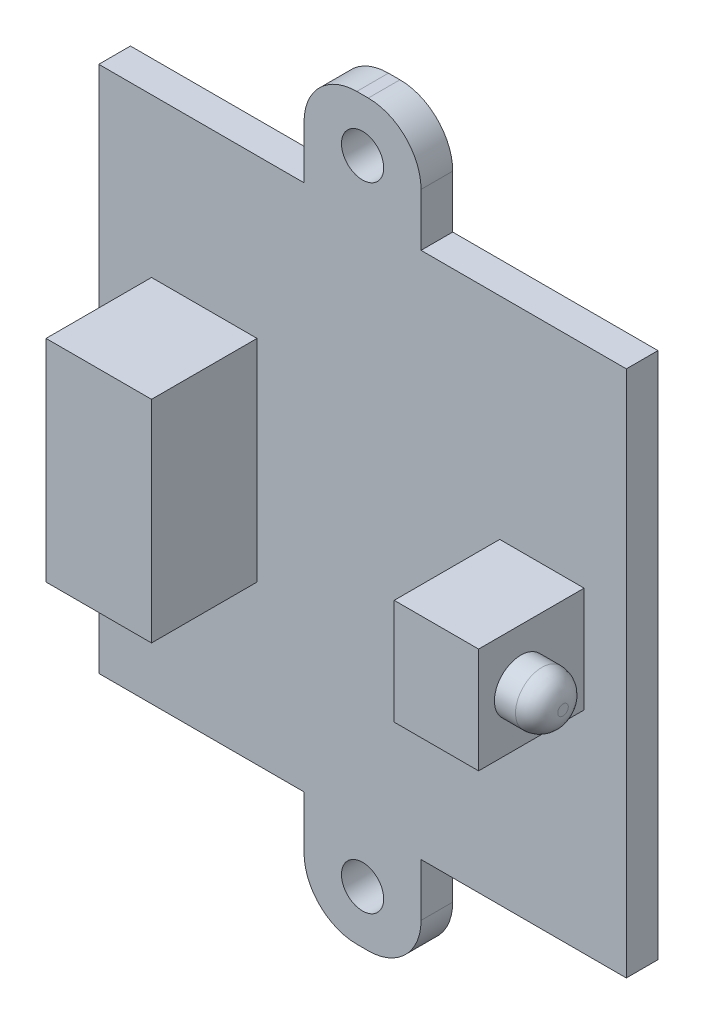
ISO-10303-21;
HEADER;
FILE_DESCRIPTION(('STEP AP214'),'2;1');
FILE_NAME('part.step','',(''),(''),'','','');
FILE_SCHEMA(('AUTOMOTIVE_DESIGN { 1 0 10303 214 1 1 1 1 }'));
ENDSEC;
DATA;
#1=APPLICATION_CONTEXT('core data for automotive mechanical design processes');
#2=APPLICATION_PROTOCOL_DEFINITION('international standard','automotive_design',2000,#1);
#3=PRODUCT_CONTEXT('',#1,'mechanical');
#4=PRODUCT('Part','Part','',(#3));
#5=PRODUCT_RELATED_PRODUCT_CATEGORY('part','',(#4));
#6=PRODUCT_DEFINITION_FORMATION('','',#4);
#7=PRODUCT_DEFINITION_CONTEXT('part definition',#1,'design');
#8=PRODUCT_DEFINITION('design','',#6,#7);
#9=PRODUCT_DEFINITION_SHAPE('','',#8);
#10=(LENGTH_UNIT() NAMED_UNIT(*) SI_UNIT(.MILLI.,.METRE.));
#11=(NAMED_UNIT(*) PLANE_ANGLE_UNIT() SI_UNIT($,.RADIAN.));
#12=(NAMED_UNIT(*) SI_UNIT($,.STERADIAN.) SOLID_ANGLE_UNIT());
#13=UNCERTAINTY_MEASURE_WITH_UNIT(LENGTH_MEASURE(1.E-05),#10,'distance_accuracy_value','');
#14=(GEOMETRIC_REPRESENTATION_CONTEXT(3) GLOBAL_UNCERTAINTY_ASSIGNED_CONTEXT((#13)) GLOBAL_UNIT_ASSIGNED_CONTEXT((#10,
#11,#12)) REPRESENTATION_CONTEXT('',''));
#15=CARTESIAN_POINT('',(0.,0.,0.));
#16=DIRECTION('',(0.,0.,1.));
#17=DIRECTION('',(1.,0.,0.));
#18=AXIS2_PLACEMENT_3D('',#15,#16,#17);
#19=CARTESIAN_POINT('',(25.,12.5,4.5));
#20=DIRECTION('',(1.,0.,0.));
#21=DIRECTION('',(0.,0.,-1.));
#22=AXIS2_PLACEMENT_3D('',#19,#20,#21);
#23=PLANE('',#22);
#24=CARTESIAN_POINT('',(25.,12.5,4.5));
#25=DIRECTION('',(-1.,0.,0.));
#26=DIRECTION('',(0.,0.,1.));
#27=AXIS2_PLACEMENT_3D('',#24,#25,#26);
#28=CIRCLE('',#27,0.249999999999999);
#29=CARTESIAN_POINT('',(25.,12.5,4.75));
#30=VERTEX_POINT('',#29);
#31=CARTESIAN_POINT('',(25.,12.5,4.25));
#32=VERTEX_POINT('',#31);
#33=EDGE_CURVE('E151',#30,#32,#28,.T.);
#34=ORIENTED_EDGE('',*,*,#33,.F.);
#35=CARTESIAN_POINT('',(25.,12.5,4.5));
#36=DIRECTION('',(-1.,0.,0.));
#37=DIRECTION('',(0.,0.,-1.));
#38=AXIS2_PLACEMENT_3D('',#35,#36,#37);
#39=CIRCLE('',#38,0.250000000000001);
#40=EDGE_CURVE('E154',#32,#30,#39,.T.);
#41=ORIENTED_EDGE('',*,*,#40,.F.);
#42=EDGE_LOOP('',(#34,#41));
#43=FACE_BOUND('',#42,.T.);
#44=ADVANCED_FACE('F17',(#43),#23,.T.);
#45=CARTESIAN_POINT('',(24.,12.5,4.25));
#46=DIRECTION('',(0.,1.,0.));
#47=DIRECTION('',(0.,0.,-1.));
#48=AXIS2_PLACEMENT_3D('',#45,#46,#47);
#49=CIRCLE('',#48,1.);
#50=TRIMMED_CURVE('',#49,(PARAMETER_VALUE(-1.82347658193698)),
(PARAMETER_VALUE(1.82347658193698)),.T.,.PARAMETER.);
#51=CARTESIAN_POINT('',(24.,12.5,4.5));
#52=DIRECTION('',(1.,0.,0.));
#53=AXIS1_PLACEMENT('',#51,#52);
#54=SURFACE_OF_REVOLUTION('',#50,#53);
#55=CARTESIAN_POINT('',(24.,12.5,4.5));
#56=DIRECTION('',(-1.,0.,0.));
#57=DIRECTION('',(0.,0.,1.));
#58=AXIS2_PLACEMENT_3D('',#55,#56,#57);
#59=CIRCLE('',#58,1.25);
#60=CARTESIAN_POINT('',(24.,12.5,5.75));
#61=VERTEX_POINT('',#60);
#62=EDGE_CURVE('E161',#61,#61,#59,.T.);
#63=ORIENTED_EDGE('',*,*,#62,.F.);
#64=EDGE_LOOP('',(#63));
#65=FACE_BOUND('',#64,.T.);
#66=ORIENTED_EDGE('',*,*,#40,.T.);
#67=ORIENTED_EDGE('',*,*,#33,.T.);
#68=EDGE_LOOP('',(#66,#67));
#69=FACE_BOUND('',#68,.T.);
#70=ADVANCED_FACE('F160',(#65,#69),#54,.F.);
#71=CARTESIAN_POINT('',(0.,0.,6.5));
#72=DIRECTION('',(0.,0.,-1.));
#73=DIRECTION('',(-1.,0.,0.));
#74=AXIS2_PLACEMENT_3D('',#71,#72,#73);
#75=PLANE('',#74);
#76=DIRECTION('',(1.,0.,0.));
#77=VECTOR('',#76,1.);
#78=CARTESIAN_POINT('',(2.5,17.5,6.5));
#79=LINE('',#78,#77);
#80=CARTESIAN_POINT('',(7.5,17.5,6.5));
#81=VERTEX_POINT('',#80);
#82=CARTESIAN_POINT('',(2.5,17.5,6.5));
#83=VERTEX_POINT('',#82);
#84=EDGE_CURVE('E185',#81,#83,#79,.F.);
#85=ORIENTED_EDGE('',*,*,#84,.T.);
#86=DIRECTION('',(0.,1.,0.));
#87=VECTOR('',#86,1.);
#88=CARTESIAN_POINT('',(2.5,7.5,6.5));
#89=LINE('',#88,#87);
#90=CARTESIAN_POINT('',(2.5,7.5,6.5));
#91=VERTEX_POINT('',#90);
#92=EDGE_CURVE('E202',#83,#91,#89,.F.);
#93=ORIENTED_EDGE('',*,*,#92,.T.);
#94=DIRECTION('',(1.,0.,0.));
#95=VECTOR('',#94,1.);
#96=CARTESIAN_POINT('',(2.5,7.5,6.5));
#97=LINE('',#96,#95);
#98=CARTESIAN_POINT('',(7.5,7.5,6.5));
#99=VERTEX_POINT('',#98);
#100=EDGE_CURVE('E193',#91,#99,#97,.T.);
#101=ORIENTED_EDGE('',*,*,#100,.T.);
#102=DIRECTION('',(0.,1.,0.));
#103=VECTOR('',#102,1.);
#104=CARTESIAN_POINT('',(7.5,7.5,6.5));
#105=LINE('',#104,#103);
#106=EDGE_CURVE('E187',#99,#81,#105,.T.);
#107=ORIENTED_EDGE('',*,*,#106,.T.);
#108=EDGE_LOOP('',(#85,#93,#101,#107));
#109=FACE_BOUND('',#108,.T.);
#110=ADVANCED_FACE('F177',(#109),#75,.F.);
#111=CARTESIAN_POINT('',(25.,12.5,4.5));
#112=DIRECTION('',(-1.,0.,0.));
#113=DIRECTION('',(0.,0.,1.));
#114=AXIS2_PLACEMENT_3D('',#111,#112,#113);
#115=CYLINDRICAL_SURFACE('',#114,1.25);
#116=ORIENTED_EDGE('',*,*,#62,.T.);
#117=EDGE_LOOP('',(#116));
#118=FACE_BOUND('',#117,.T.);
#119=CARTESIAN_POINT('',(23.,12.5,4.5));
#120=DIRECTION('',(-1.,0.,0.));
#121=DIRECTION('',(0.,0.,1.));
#122=AXIS2_PLACEMENT_3D('',#119,#120,#121);
#123=CIRCLE('',#122,1.25);
#124=CARTESIAN_POINT('',(23.,12.5,5.75));
#125=VERTEX_POINT('',#124);
#126=EDGE_CURVE('E222',#125,#125,#123,.F.);
#127=ORIENTED_EDGE('',*,*,#126,.T.);
#128=EDGE_LOOP('',(#127));
#129=FACE_BOUND('',#128,.T.);
#130=ADVANCED_FACE('F449',(#118,#129),#115,.T.);
#131=CARTESIAN_POINT('',(0.,0.,6.5));
#132=DIRECTION('',(0.,0.,1.));
#133=DIRECTION('',(1.,0.,0.));
#134=AXIS2_PLACEMENT_3D('',#131,#132,#133);
#135=PLANE('',#134);
#136=DIRECTION('',(0.,1.,0.));
#137=VECTOR('',#136,1.);
#138=CARTESIAN_POINT('',(19.,15.,6.5));
#139=LINE('',#138,#137);
#140=CARTESIAN_POINT('',(19.,15.,6.5));
#141=VERTEX_POINT('',#140);
#142=CARTESIAN_POINT('',(19.,10.,6.5));
#143=VERTEX_POINT('',#142);
#144=EDGE_CURVE('E208',#141,#143,#139,.F.);
#145=ORIENTED_EDGE('',*,*,#144,.T.);
#146=DIRECTION('',(1.,0.,0.));
#147=VECTOR('',#146,1.);
#148=CARTESIAN_POINT('',(19.,10.,6.5));
#149=LINE('',#148,#147);
#150=CARTESIAN_POINT('',(23.,10.,6.5));
#151=VERTEX_POINT('',#150);
#152=EDGE_CURVE('E226',#143,#151,#149,.T.);
#153=ORIENTED_EDGE('',*,*,#152,.T.);
#154=DIRECTION('',(0.,1.,0.));
#155=VECTOR('',#154,1.);
#156=CARTESIAN_POINT('',(23.,10.,6.5));
#157=LINE('',#156,#155);
#158=CARTESIAN_POINT('',(23.,15.,6.5));
#159=VERTEX_POINT('',#158);
#160=EDGE_CURVE('E216',#151,#159,#157,.T.);
#161=ORIENTED_EDGE('',*,*,#160,.T.);
#162=DIRECTION('',(1.,0.,0.));
#163=VECTOR('',#162,1.);
#164=CARTESIAN_POINT('',(23.,15.,6.5));
#165=LINE('',#164,#163);
#166=EDGE_CURVE('E210',#159,#141,#165,.F.);
#167=ORIENTED_EDGE('',*,*,#166,.T.);
#168=EDGE_LOOP('',(#145,#153,#161,#167));
#169=FACE_BOUND('',#168,.T.);
#170=ADVANCED_FACE('F464',(#169),#135,.T.);
#171=CARTESIAN_POINT('',(2.5,17.5,6.5));
#172=DIRECTION('',(0.,-1.,0.));
#173=DIRECTION('',(0.,0.,-1.));
#174=AXIS2_PLACEMENT_3D('',#171,#172,#173);
#175=PLANE('',#174);
#176=DIRECTION('',(0.,0.,-1.));
#177=VECTOR('',#176,1.);
#178=CARTESIAN_POINT('',(2.5,17.5,6.5));
#179=LINE('',#178,#177);
#180=CARTESIAN_POINT('',(2.5,17.5,1.5));
#181=VERTEX_POINT('',#180);
#182=EDGE_CURVE('E199',#181,#83,#179,.F.);
#183=ORIENTED_EDGE('',*,*,#182,.T.);
#184=ORIENTED_EDGE('',*,*,#84,.F.);
#185=DIRECTION('',(0.,0.,1.));
#186=VECTOR('',#185,1.);
#187=CARTESIAN_POINT('',(7.5,17.5,6.5));
#188=LINE('',#187,#186);
#189=CARTESIAN_POINT('',(7.5,17.5,1.5));
#190=VERTEX_POINT('',#189);
#191=EDGE_CURVE('E190',#81,#190,#188,.F.);
#192=ORIENTED_EDGE('',*,*,#191,.T.);
#193=DIRECTION('',(1.,0.,0.));
#194=VECTOR('',#193,1.);
#195=CARTESIAN_POINT('',(0.,17.5,1.5));
#196=LINE('',#195,#194);
#197=EDGE_CURVE('E281',#181,#190,#196,.T.);
#198=ORIENTED_EDGE('',*,*,#197,.F.);
#199=EDGE_LOOP('',(#183,#184,#192,#198));
#200=FACE_BOUND('',#199,.T.);
#201=ADVANCED_FACE('F620',(#200),#175,.F.);
#202=CARTESIAN_POINT('',(7.5,7.5,6.5));
#203=DIRECTION('',(-1.,0.,0.));
#204=DIRECTION('',(0.,0.,1.));
#205=AXIS2_PLACEMENT_3D('',#202,#203,#204);
#206=PLANE('',#205);
#207=ORIENTED_EDGE('',*,*,#191,.F.);
#208=ORIENTED_EDGE('',*,*,#106,.F.);
#209=DIRECTION('',(0.,0.,1.));
#210=VECTOR('',#209,1.);
#211=CARTESIAN_POINT('',(7.5,7.5,6.5));
#212=LINE('',#211,#210);
#213=CARTESIAN_POINT('',(7.5,7.5,1.5));
#214=VERTEX_POINT('',#213);
#215=EDGE_CURVE('E196',#99,#214,#212,.F.);
#216=ORIENTED_EDGE('',*,*,#215,.T.);
#217=DIRECTION('',(0.,1.,0.));
#218=VECTOR('',#217,1.);
#219=CARTESIAN_POINT('',(7.5,0.,1.5));
#220=LINE('',#219,#218);
#221=EDGE_CURVE('E294',#190,#214,#220,.F.);
#222=ORIENTED_EDGE('',*,*,#221,.F.);
#223=EDGE_LOOP('',(#207,#208,#216,#222));
#224=FACE_BOUND('',#223,.T.);
#225=ADVANCED_FACE('F616',(#224),#206,.F.);
#226=CARTESIAN_POINT('',(2.5,7.5,6.5));
#227=DIRECTION('',(0.,1.,0.));
#228=DIRECTION('',(0.,0.,1.));
#229=AXIS2_PLACEMENT_3D('',#226,#227,#228);
#230=PLANE('',#229);
#231=ORIENTED_EDGE('',*,*,#215,.F.);
#232=ORIENTED_EDGE('',*,*,#100,.F.);
#233=DIRECTION('',(0.,0.,-1.));
#234=VECTOR('',#233,1.);
#235=CARTESIAN_POINT('',(2.5,7.5,6.5));
#236=LINE('',#235,#234);
#237=CARTESIAN_POINT('',(2.5,7.5,1.5));
#238=VERTEX_POINT('',#237);
#239=EDGE_CURVE('E205',#91,#238,#236,.T.);
#240=ORIENTED_EDGE('',*,*,#239,.T.);
#241=DIRECTION('',(1.,0.,0.));
#242=VECTOR('',#241,1.);
#243=CARTESIAN_POINT('',(0.,7.5,1.5));
#244=LINE('',#243,#242);
#245=EDGE_CURVE('E297',#214,#238,#244,.F.);
#246=ORIENTED_EDGE('',*,*,#245,.F.);
#247=EDGE_LOOP('',(#231,#232,#240,#246));
#248=FACE_BOUND('',#247,.T.);
#249=ADVANCED_FACE('F612',(#248),#230,.F.);
#250=CARTESIAN_POINT('',(2.5,7.5,6.5));
#251=DIRECTION('',(1.,0.,0.));
#252=DIRECTION('',(0.,0.,-1.));
#253=AXIS2_PLACEMENT_3D('',#250,#251,#252);
#254=PLANE('',#253);
#255=ORIENTED_EDGE('',*,*,#239,.F.);
#256=ORIENTED_EDGE('',*,*,#92,.F.);
#257=ORIENTED_EDGE('',*,*,#182,.F.);
#258=DIRECTION('',(0.,1.,0.));
#259=VECTOR('',#258,1.);
#260=CARTESIAN_POINT('',(2.5,0.,1.5));
#261=LINE('',#260,#259);
#262=EDGE_CURVE('E300',#238,#181,#261,.T.);
#263=ORIENTED_EDGE('',*,*,#262,.F.);
#264=EDGE_LOOP('',(#255,#256,#257,#263));
#265=FACE_BOUND('',#264,.T.);
#266=ADVANCED_FACE('F609',(#265),#254,.F.);
#267=CARTESIAN_POINT('',(19.,15.,6.5));
#268=DIRECTION('',(1.,0.,0.));
#269=DIRECTION('',(0.,1.,0.));
#270=AXIS2_PLACEMENT_3D('',#267,#268,#269);
#271=PLANE('',#270);
#272=DIRECTION('',(0.,0.,1.));
#273=VECTOR('',#272,1.);
#274=CARTESIAN_POINT('',(19.,10.,6.5));
#275=LINE('',#274,#273);
#276=CARTESIAN_POINT('',(19.,10.,1.5));
#277=VERTEX_POINT('',#276);
#278=EDGE_CURVE('E223',#277,#143,#275,.T.);
#279=ORIENTED_EDGE('',*,*,#278,.T.);
#280=ORIENTED_EDGE('',*,*,#144,.F.);
#281=DIRECTION('',(0.,0.,1.));
#282=VECTOR('',#281,1.);
#283=CARTESIAN_POINT('',(19.,15.,6.5));
#284=LINE('',#283,#282);
#285=CARTESIAN_POINT('',(19.,15.,1.5));
#286=VERTEX_POINT('',#285);
#287=EDGE_CURVE('E213',#141,#286,#284,.F.);
#288=ORIENTED_EDGE('',*,*,#287,.T.);
#289=DIRECTION('',(0.,1.,0.));
#290=VECTOR('',#289,1.);
#291=CARTESIAN_POINT('',(19.,0.,1.5));
#292=LINE('',#291,#290);
#293=EDGE_CURVE('E306',#277,#286,#292,.T.);
#294=ORIENTED_EDGE('',*,*,#293,.F.);
#295=EDGE_LOOP('',(#279,#280,#288,#294));
#296=FACE_BOUND('',#295,.T.);
#297=ADVANCED_FACE('F472',(#296),#271,.F.);
#298=CARTESIAN_POINT('',(23.,15.,6.5));
#299=DIRECTION('',(0.,-1.,0.));
#300=DIRECTION('',(1.,0.,0.));
#301=AXIS2_PLACEMENT_3D('',#298,#299,#300);
#302=PLANE('',#301);
#303=ORIENTED_EDGE('',*,*,#287,.F.);
#304=ORIENTED_EDGE('',*,*,#166,.F.);
#305=DIRECTION('',(0.,0.,1.));
#306=VECTOR('',#305,1.);
#307=CARTESIAN_POINT('',(23.,15.,6.5));
#308=LINE('',#307,#306);
#309=CARTESIAN_POINT('',(23.,15.,1.5));
#310=VERTEX_POINT('',#309);
#311=EDGE_CURVE('E219',#159,#310,#308,.F.);
#312=ORIENTED_EDGE('',*,*,#311,.T.);
#313=DIRECTION('',(1.,0.,0.));
#314=VECTOR('',#313,1.);
#315=CARTESIAN_POINT('',(0.,15.,1.5));
#316=LINE('',#315,#314);
#317=EDGE_CURVE('E309',#286,#310,#316,.T.);
#318=ORIENTED_EDGE('',*,*,#317,.F.);
#319=EDGE_LOOP('',(#303,#304,#312,#318));
#320=FACE_BOUND('',#319,.T.);
#321=ADVANCED_FACE('F455',(#320),#302,.F.);
#322=CARTESIAN_POINT('',(23.,10.,6.5));
#323=DIRECTION('',(-1.,0.,0.));
#324=DIRECTION('',(0.,0.,1.));
#325=AXIS2_PLACEMENT_3D('',#322,#323,#324);
#326=PLANE('',#325);
#327=ORIENTED_EDGE('',*,*,#126,.F.);
#328=EDGE_LOOP('',(#327));
#329=FACE_BOUND('',#328,.T.);
#330=ORIENTED_EDGE('',*,*,#311,.F.);
#331=ORIENTED_EDGE('',*,*,#160,.F.);
#332=DIRECTION('',(0.,0.,1.));
#333=VECTOR('',#332,1.);
#334=CARTESIAN_POINT('',(23.,10.,6.5));
#335=LINE('',#334,#333);
#336=CARTESIAN_POINT('',(23.,10.,1.5));
#337=VERTEX_POINT('',#336);
#338=EDGE_CURVE('E229',#151,#337,#335,.F.);
#339=ORIENTED_EDGE('',*,*,#338,.T.);
#340=DIRECTION('',(0.,1.,0.));
#341=VECTOR('',#340,1.);
#342=CARTESIAN_POINT('',(23.,0.,1.5));
#343=LINE('',#342,#341);
#344=EDGE_CURVE('E312',#310,#337,#343,.F.);
#345=ORIENTED_EDGE('',*,*,#344,.F.);
#346=EDGE_LOOP('',(#330,#331,#339,#345));
#347=FACE_BOUND('',#346,.T.);
#348=ADVANCED_FACE('F451',(#329,#347),#326,.F.);
#349=CARTESIAN_POINT('',(19.,10.,6.5));
#350=DIRECTION('',(0.,1.,0.));
#351=DIRECTION('',(0.,0.,1.));
#352=AXIS2_PLACEMENT_3D('',#349,#350,#351);
#353=PLANE('',#352);
#354=ORIENTED_EDGE('',*,*,#338,.F.);
#355=ORIENTED_EDGE('',*,*,#152,.F.);
#356=ORIENTED_EDGE('',*,*,#278,.F.);
#357=DIRECTION('',(1.,0.,0.));
#358=VECTOR('',#357,1.);
#359=CARTESIAN_POINT('',(0.,10.,1.5));
#360=LINE('',#359,#358);
#361=EDGE_CURVE('E285',#337,#277,#360,.F.);
#362=ORIENTED_EDGE('',*,*,#361,.F.);
#363=EDGE_LOOP('',(#354,#355,#356,#362));
#364=FACE_BOUND('',#363,.T.);
#365=ADVANCED_FACE('F454',(#364),#353,.F.);
#366=CARTESIAN_POINT('',(0.,-5.,1.5));
#367=DIRECTION('',(0.,1.,0.));
#368=DIRECTION('',(0.,0.,1.));
#369=AXIS2_PLACEMENT_3D('',#366,#367,#368);
#370=PLANE('',#369);
#371=DIRECTION('',(0.,0.,-1.));
#372=VECTOR('',#371,1.);
#373=CARTESIAN_POINT('',(12.7722949685963,-5.,1.5));
#374=LINE('',#373,#372);
#375=CARTESIAN_POINT('',(12.7722949685963,-5.,1.5));
#376=VERTEX_POINT('',#375);
#377=CARTESIAN_POINT('',(12.7722949685963,-5.,0.));
#378=VERTEX_POINT('',#377);
#379=EDGE_CURVE('E345',#376,#378,#374,.T.);
#380=ORIENTED_EDGE('',*,*,#379,.F.);
#381=DIRECTION('',(1.,0.,0.));
#382=VECTOR('',#381,1.);
#383=CARTESIAN_POINT('',(0.,-5.,1.5));
#384=LINE('',#383,#382);
#385=CARTESIAN_POINT('',(12.2277050314038,-5.,1.5));
#386=VERTEX_POINT('',#385);
#387=EDGE_CURVE('E91',#386,#376,#384,.T.);
#388=ORIENTED_EDGE('',*,*,#387,.F.);
#389=DIRECTION('',(0.,0.,1.));
#390=VECTOR('',#389,1.);
#391=CARTESIAN_POINT('',(12.2277050314038,-5.,1.5));
#392=LINE('',#391,#390);
#393=CARTESIAN_POINT('',(12.2277050314038,-5.,0.));
#394=VERTEX_POINT('',#393);
#395=EDGE_CURVE('E340',#394,#386,#392,.T.);
#396=ORIENTED_EDGE('',*,*,#395,.F.);
#397=DIRECTION('',(1.,0.,0.));
#398=VECTOR('',#397,1.);
#399=CARTESIAN_POINT('',(0.,-5.,0.));
#400=LINE('',#399,#398);
#401=EDGE_CURVE('E232',#378,#394,#400,.F.);
#402=ORIENTED_EDGE('',*,*,#401,.F.);
#403=EDGE_LOOP('',(#380,#388,#396,#402));
#404=FACE_BOUND('',#403,.T.);
#405=ADVANCED_FACE('F522',(#404),#370,.F.);
#406=CARTESIAN_POINT('',(0.,30.,1.5));
#407=DIRECTION('',(0.,1.,0.));
#408=DIRECTION('',(0.,0.,1.));
#409=AXIS2_PLACEMENT_3D('',#406,#407,#408);
#410=PLANE('',#409);
#411=DIRECTION('',(1.,0.,0.));
#412=VECTOR('',#411,1.);
#413=CARTESIAN_POINT('',(0.,30.,1.5));
#414=LINE('',#413,#412);
#415=CARTESIAN_POINT('',(12.7722949685963,30.,1.5));
#416=VERTEX_POINT('',#415);
#417=CARTESIAN_POINT('',(12.2277050314038,30.,1.5));
#418=VERTEX_POINT('',#417);
#419=EDGE_CURVE('E303',#416,#418,#414,.F.);
#420=ORIENTED_EDGE('',*,*,#419,.F.);
#421=DIRECTION('',(0.,0.,-1.));
#422=VECTOR('',#421,1.);
#423=CARTESIAN_POINT('',(12.7722949685963,30.,1.5));
#424=LINE('',#423,#422);
#425=CARTESIAN_POINT('',(12.7722949685963,30.,0.));
#426=VERTEX_POINT('',#425);
#427=EDGE_CURVE('E384',#426,#416,#424,.F.);
#428=ORIENTED_EDGE('',*,*,#427,.F.);
#429=DIRECTION('',(1.,0.,0.));
#430=VECTOR('',#429,1.);
#431=CARTESIAN_POINT('',(0.,30.,0.));
#432=LINE('',#431,#430);
#433=CARTESIAN_POINT('',(12.2277050314038,30.,0.));
#434=VERTEX_POINT('',#433);
#435=EDGE_CURVE('E249',#426,#434,#432,.F.);
#436=ORIENTED_EDGE('',*,*,#435,.T.);
#437=DIRECTION('',(0.,0.,1.));
#438=VECTOR('',#437,1.);
#439=CARTESIAN_POINT('',(12.2277050314038,30.,1.5));
#440=LINE('',#439,#438);
#441=EDGE_CURVE('E390',#418,#434,#440,.F.);
#442=ORIENTED_EDGE('',*,*,#441,.F.);
#443=EDGE_LOOP('',(#420,#428,#436,#442));
#444=FACE_BOUND('',#443,.T.);
#445=ADVANCED_FACE('F544',(#444),#410,.T.);
#446=CARTESIAN_POINT('',(0.,0.,1.5));
#447=DIRECTION('',(0.,0.,1.));
#448=DIRECTION('',(1.,0.,0.));
#449=AXIS2_PLACEMENT_3D('',#446,#447,#448);
#450=PLANE('',#449);
#451=ORIENTED_EDGE('',*,*,#344,.T.);
#452=ORIENTED_EDGE('',*,*,#361,.T.);
#453=ORIENTED_EDGE('',*,*,#293,.T.);
#454=ORIENTED_EDGE('',*,*,#317,.T.);
#455=EDGE_LOOP('',(#451,#452,#453,#454));
#456=FACE_BOUND('',#455,.T.);
#457=CARTESIAN_POINT('',(12.5,-2.5,1.5));
#458=DIRECTION('',(0.,0.,-1.));
#459=DIRECTION('',(-1.,0.,0.));
#460=AXIS2_PLACEMENT_3D('',#457,#458,#459);
#461=CIRCLE('',#460,1.);
#462=CARTESIAN_POINT('',(11.5,-2.5,1.5));
#463=VERTEX_POINT('',#462);
#464=EDGE_CURVE('E398',#463,#463,#461,.T.);
#465=ORIENTED_EDGE('',*,*,#464,.T.);
#466=EDGE_LOOP('',(#465));
#467=FACE_BOUND('',#466,.T.);
#468=CARTESIAN_POINT('',(12.5,27.5,1.5));
#469=DIRECTION('',(0.,0.,-1.));
#470=DIRECTION('',(-1.,0.,0.));
#471=AXIS2_PLACEMENT_3D('',#468,#469,#470);
#472=CIRCLE('',#471,1.);
#473=CARTESIAN_POINT('',(11.5,27.5,1.5));
#474=VERTEX_POINT('',#473);
#475=EDGE_CURVE('E291',#474,#474,#472,.T.);
#476=ORIENTED_EDGE('',*,*,#475,.T.);
#477=EDGE_LOOP('',(#476));
#478=FACE_BOUND('',#477,.T.);
#479=DIRECTION('',(0.,1.,0.));
#480=VECTOR('',#479,1.);
#481=CARTESIAN_POINT('',(15.2722949685963,0.,1.5));
#482=LINE('',#481,#480);
#483=CARTESIAN_POINT('',(15.2722949685963,27.5,1.5));
#484=VERTEX_POINT('',#483);
#485=CARTESIAN_POINT('',(15.2722949685963,25.,1.5));
#486=VERTEX_POINT('',#485);
#487=EDGE_CURVE('E276',#484,#486,#482,.F.);
#488=ORIENTED_EDGE('',*,*,#487,.F.);
#489=CARTESIAN_POINT('',(12.7722949685963,27.5,1.5));
#490=DIRECTION('',(0.,0.,-1.));
#491=DIRECTION('',(-1.,0.,0.));
#492=AXIS2_PLACEMENT_3D('',#489,#490,#491);
#493=CIRCLE('',#492,2.5);
#494=EDGE_CURVE('E383',#416,#484,#493,.T.);
#495=ORIENTED_EDGE('',*,*,#494,.F.);
#496=ORIENTED_EDGE('',*,*,#419,.T.);
#497=CARTESIAN_POINT('',(12.2277050314038,27.5,1.5));
#498=DIRECTION('',(0.,0.,1.));
#499=DIRECTION('',(1.,0.,0.));
#500=AXIS2_PLACEMENT_3D('',#497,#498,#499);
#501=CIRCLE('',#500,2.5);
#502=CARTESIAN_POINT('',(9.72770503140375,27.5,1.5));
#503=VERTEX_POINT('',#502);
#504=EDGE_CURVE('E387',#503,#418,#501,.F.);
#505=ORIENTED_EDGE('',*,*,#504,.F.);
#506=DIRECTION('',(0.,1.,0.));
#507=VECTOR('',#506,1.);
#508=CARTESIAN_POINT('',(9.72770503140375,0.,1.5));
#509=LINE('',#508,#507);
#510=CARTESIAN_POINT('',(9.72770503140375,25.,1.5));
#511=VERTEX_POINT('',#510);
#512=EDGE_CURVE('E288',#503,#511,#509,.F.);
#513=ORIENTED_EDGE('',*,*,#512,.T.);
#514=DIRECTION('',(1.,0.,0.));
#515=VECTOR('',#514,1.);
#516=CARTESIAN_POINT('',(0.,25.,1.5));
#517=LINE('',#516,#515);
#518=CARTESIAN_POINT('',(0.,25.,1.5));
#519=VERTEX_POINT('',#518);
#520=EDGE_CURVE('E238',#519,#511,#517,.T.);
#521=ORIENTED_EDGE('',*,*,#520,.F.);
#522=DIRECTION('',(0.,1.,0.));
#523=VECTOR('',#522,1.);
#524=CARTESIAN_POINT('',(0.,0.,1.5));
#525=LINE('',#524,#523);
#526=CARTESIAN_POINT('',(0.,0.,1.5));
#527=VERTEX_POINT('',#526);
#528=EDGE_CURVE('E235',#527,#519,#525,.T.);
#529=ORIENTED_EDGE('',*,*,#528,.F.);
#530=DIRECTION('',(1.,0.,0.));
#531=VECTOR('',#530,1.);
#532=CARTESIAN_POINT('',(0.,0.,1.5));
#533=LINE('',#532,#531);
#534=CARTESIAN_POINT('',(9.72770503140375,0.,1.5));
#535=VERTEX_POINT('',#534);
#536=EDGE_CURVE('E241',#527,#535,#533,.T.);
#537=ORIENTED_EDGE('',*,*,#536,.T.);
#538=DIRECTION('',(0.,1.,0.));
#539=VECTOR('',#538,1.);
#540=CARTESIAN_POINT('',(9.72770503140375,0.,1.5));
#541=LINE('',#540,#539);
#542=CARTESIAN_POINT('',(9.72770503140375,-2.5,1.5));
#543=VERTEX_POINT('',#542);
#544=EDGE_CURVE('E101',#543,#535,#541,.T.);
#545=ORIENTED_EDGE('',*,*,#544,.F.);
#546=CARTESIAN_POINT('',(12.2277050314038,-2.5,1.5));
#547=DIRECTION('',(0.,0.,1.));
#548=DIRECTION('',(1.,0.,0.));
#549=AXIS2_PLACEMENT_3D('',#546,#547,#548);
#550=CIRCLE('',#549,2.5);
#551=EDGE_CURVE('E339',#386,#543,#550,.F.);
#552=ORIENTED_EDGE('',*,*,#551,.F.);
#553=ORIENTED_EDGE('',*,*,#387,.T.);
#554=CARTESIAN_POINT('',(12.7722949685963,-2.5,1.5));
#555=DIRECTION('',(0.,0.,-1.));
#556=DIRECTION('',(-1.,0.,0.));
#557=AXIS2_PLACEMENT_3D('',#554,#555,#556);
#558=CIRCLE('',#557,2.5);
#559=CARTESIAN_POINT('',(15.2722949685963,-2.5,1.5));
#560=VERTEX_POINT('',#559);
#561=EDGE_CURVE('E342',#560,#376,#558,.T.);
#562=ORIENTED_EDGE('',*,*,#561,.F.);
#563=DIRECTION('',(0.,1.,0.));
#564=VECTOR('',#563,1.);
#565=CARTESIAN_POINT('',(15.2722949685963,0.,1.5));
#566=LINE('',#565,#564);
#567=CARTESIAN_POINT('',(15.2722949685963,0.,1.5));
#568=VERTEX_POINT('',#567);
#569=EDGE_CURVE('E252',#560,#568,#566,.T.);
#570=ORIENTED_EDGE('',*,*,#569,.T.);
#571=DIRECTION('',(1.,0.,0.));
#572=VECTOR('',#571,1.);
#573=CARTESIAN_POINT('',(0.,0.,1.5));
#574=LINE('',#573,#572);
#575=CARTESIAN_POINT('',(25.,0.,1.5));
#576=VERTEX_POINT('',#575);
#577=EDGE_CURVE('E259',#568,#576,#574,.T.);
#578=ORIENTED_EDGE('',*,*,#577,.T.);
#579=DIRECTION('',(0.,1.,0.));
#580=VECTOR('',#579,1.);
#581=CARTESIAN_POINT('',(25.,0.,1.5));
#582=LINE('',#581,#580);
#583=CARTESIAN_POINT('',(25.,25.,1.5));
#584=VERTEX_POINT('',#583);
#585=EDGE_CURVE('E265',#576,#584,#582,.T.);
#586=ORIENTED_EDGE('',*,*,#585,.T.);
#587=DIRECTION('',(1.,0.,0.));
#588=VECTOR('',#587,1.);
#589=CARTESIAN_POINT('',(0.,25.,1.5));
#590=LINE('',#589,#588);
#591=EDGE_CURVE('E268',#486,#584,#590,.T.);
#592=ORIENTED_EDGE('',*,*,#591,.F.);
#593=EDGE_LOOP('',(#488,#495,#496,#505,#513,#521,#529,#537,#545,#552,#553,#562,#570,#578,#586,#592));
#594=FACE_BOUND('',#593,.T.);
#595=ORIENTED_EDGE('',*,*,#245,.T.);
#596=ORIENTED_EDGE('',*,*,#262,.T.);
#597=ORIENTED_EDGE('',*,*,#197,.T.);
#598=ORIENTED_EDGE('',*,*,#221,.T.);
#599=EDGE_LOOP('',(#595,#596,#597,#598));
#600=FACE_BOUND('',#599,.T.);
#601=ADVANCED_FACE('F478',(#456,#467,#478,#594,#600),#450,.T.);
#602=CARTESIAN_POINT('',(0.,25.,1.5));
#603=DIRECTION('',(0.,1.,0.));
#604=DIRECTION('',(0.,0.,1.));
#605=AXIS2_PLACEMENT_3D('',#602,#603,#604);
#606=PLANE('',#605);
#607=ORIENTED_EDGE('',*,*,#520,.T.);
#608=DIRECTION('',(0.,0.,-1.));
#609=VECTOR('',#608,1.);
#610=CARTESIAN_POINT('',(9.72770503140375,25.,1.5));
#611=LINE('',#610,#609);
#612=CARTESIAN_POINT('',(9.72770503140375,25.,0.));
#613=VERTEX_POINT('',#612);
#614=EDGE_CURVE('E393',#511,#613,#611,.T.);
#615=ORIENTED_EDGE('',*,*,#614,.T.);
#616=DIRECTION('',(1.,0.,0.));
#617=VECTOR('',#616,1.);
#618=CARTESIAN_POINT('',(0.,25.,0.));
#619=LINE('',#618,#617);
#620=CARTESIAN_POINT('',(0.,25.,0.));
#621=VERTEX_POINT('',#620);
#622=EDGE_CURVE('E326',#613,#621,#619,.F.);
#623=ORIENTED_EDGE('',*,*,#622,.T.);
#624=DIRECTION('',(0.,0.,1.));
#625=VECTOR('',#624,1.);
#626=CARTESIAN_POINT('',(0.,25.,1.5));
#627=LINE('',#626,#625);
#628=EDGE_CURVE('E237',#519,#621,#627,.F.);
#629=ORIENTED_EDGE('',*,*,#628,.F.);
#630=EDGE_LOOP('',(#607,#615,#623,#629));
#631=FACE_BOUND('',#630,.T.);
#632=ADVANCED_FACE('F538',(#631),#606,.T.);
#633=CARTESIAN_POINT('',(0.,0.,1.5));
#634=DIRECTION('',(-1.,0.,0.));
#635=DIRECTION('',(0.,0.,1.));
#636=AXIS2_PLACEMENT_3D('',#633,#634,#635);
#637=PLANE('',#636);
#638=ORIENTED_EDGE('',*,*,#528,.T.);
#639=ORIENTED_EDGE('',*,*,#628,.T.);
#640=DIRECTION('',(0.,1.,0.));
#641=VECTOR('',#640,1.);
#642=CARTESIAN_POINT('',(0.,0.,0.));
#643=LINE('',#642,#641);
#644=CARTESIAN_POINT('',(0.,0.,0.));
#645=VERTEX_POINT('',#644);
#646=EDGE_CURVE('E322',#621,#645,#643,.F.);
#647=ORIENTED_EDGE('',*,*,#646,.T.);
#648=DIRECTION('',(0.,0.,1.));
#649=VECTOR('',#648,1.);
#650=CARTESIAN_POINT('',(0.,0.,1.5));
#651=LINE('',#650,#649);
#652=EDGE_CURVE('E243',#645,#527,#651,.T.);
#653=ORIENTED_EDGE('',*,*,#652,.T.);
#654=EDGE_LOOP('',(#638,#639,#647,#653));
#655=FACE_BOUND('',#654,.T.);
#656=ADVANCED_FACE('F534',(#655),#637,.T.);
#657=CARTESIAN_POINT('',(0.,0.,1.5));
#658=DIRECTION('',(0.,1.,0.));
#659=DIRECTION('',(0.,0.,1.));
#660=AXIS2_PLACEMENT_3D('',#657,#658,#659);
#661=PLANE('',#660);
#662=DIRECTION('',(0.,0.,1.));
#663=VECTOR('',#662,1.);
#664=CARTESIAN_POINT('',(9.72770503140375,0.,1.5));
#665=LINE('',#664,#663);
#666=CARTESIAN_POINT('',(9.72770503140375,0.,0.));
#667=VERTEX_POINT('',#666);
#668=EDGE_CURVE('E247',#535,#667,#665,.F.);
#669=ORIENTED_EDGE('',*,*,#668,.F.);
#670=ORIENTED_EDGE('',*,*,#536,.F.);
#671=ORIENTED_EDGE('',*,*,#652,.F.);
#672=DIRECTION('',(1.,0.,0.));
#673=VECTOR('',#672,1.);
#674=CARTESIAN_POINT('',(0.,0.,0.));
#675=LINE('',#674,#673);
#676=EDGE_CURVE('E325',#645,#667,#675,.T.);
#677=ORIENTED_EDGE('',*,*,#676,.T.);
#678=EDGE_LOOP('',(#669,#670,#671,#677));
#679=FACE_BOUND('',#678,.T.);
#680=ADVANCED_FACE('F531',(#679),#661,.F.);
#681=CARTESIAN_POINT('',(9.72770503140375,0.,1.5));
#682=DIRECTION('',(-1.,0.,0.));
#683=DIRECTION('',(0.,0.,1.));
#684=AXIS2_PLACEMENT_3D('',#681,#682,#683);
#685=PLANE('',#684);
#686=ORIENTED_EDGE('',*,*,#544,.T.);
#687=ORIENTED_EDGE('',*,*,#668,.T.);
#688=DIRECTION('',(0.,1.,0.));
#689=VECTOR('',#688,1.);
#690=CARTESIAN_POINT('',(9.72770503140375,0.,0.));
#691=LINE('',#690,#689);
#692=CARTESIAN_POINT('',(9.72770503140375,-2.5,0.));
#693=VERTEX_POINT('',#692);
#694=EDGE_CURVE('E335',#667,#693,#691,.F.);
#695=ORIENTED_EDGE('',*,*,#694,.T.);
#696=DIRECTION('',(0.,0.,1.));
#697=VECTOR('',#696,1.);
#698=CARTESIAN_POINT('',(9.72770503140375,-2.5,1.5));
#699=LINE('',#698,#697);
#700=EDGE_CURVE('E343',#543,#693,#699,.F.);
#701=ORIENTED_EDGE('',*,*,#700,.F.);
#702=EDGE_LOOP('',(#686,#687,#695,#701));
#703=FACE_BOUND('',#702,.T.);
#704=ADVANCED_FACE('F527',(#703),#685,.T.);
#705=CARTESIAN_POINT('',(12.2277050314038,-2.5,1.5));
#706=DIRECTION('',(0.,0.,1.));
#707=DIRECTION('',(1.,0.,0.));
#708=AXIS2_PLACEMENT_3D('',#705,#706,#707);
#709=CYLINDRICAL_SURFACE('',#708,2.5);
#710=CARTESIAN_POINT('',(12.2277050314038,-2.5,0.));
#711=DIRECTION('',(0.,0.,1.));
#712=DIRECTION('',(1.,0.,0.));
#713=AXIS2_PLACEMENT_3D('',#710,#711,#712);
#714=CIRCLE('',#713,2.5);
#715=EDGE_CURVE('E408',#693,#394,#714,.T.);
#716=ORIENTED_EDGE('',*,*,#715,.T.);
#717=ORIENTED_EDGE('',*,*,#395,.T.);
#718=ORIENTED_EDGE('',*,*,#551,.T.);
#719=ORIENTED_EDGE('',*,*,#700,.T.);
#720=EDGE_LOOP('',(#716,#717,#718,#719));
#721=FACE_BOUND('',#720,.T.);
#722=ADVANCED_FACE('F754',(#721),#709,.T.);
#723=CARTESIAN_POINT('',(12.7722949685963,-2.5,1.5));
#724=DIRECTION('',(0.,0.,-1.));
#725=DIRECTION('',(-1.,0.,0.));
#726=AXIS2_PLACEMENT_3D('',#723,#724,#725);
#727=CYLINDRICAL_SURFACE('',#726,2.5);
#728=CARTESIAN_POINT('',(12.7722949685963,-2.5,0.));
#729=DIRECTION('',(0.,0.,-1.));
#730=DIRECTION('',(-1.,0.,0.));
#731=AXIS2_PLACEMENT_3D('',#728,#729,#730);
#732=CIRCLE('',#731,2.5);
#733=CARTESIAN_POINT('',(15.2722949685963,-2.5,0.));
#734=VERTEX_POINT('',#733);
#735=EDGE_CURVE('E413',#378,#734,#732,.F.);
#736=ORIENTED_EDGE('',*,*,#735,.T.);
#737=DIRECTION('',(0.,0.,1.));
#738=VECTOR('',#737,1.);
#739=CARTESIAN_POINT('',(15.2722949685963,-2.5,1.5));
#740=LINE('',#739,#738);
#741=EDGE_CURVE('E256',#734,#560,#740,.T.);
#742=ORIENTED_EDGE('',*,*,#741,.T.);
#743=ORIENTED_EDGE('',*,*,#561,.T.);
#744=ORIENTED_EDGE('',*,*,#379,.T.);
#745=EDGE_LOOP('',(#736,#742,#743,#744));
#746=FACE_BOUND('',#745,.T.);
#747=ADVANCED_FACE('F521',(#746),#727,.T.);
#748=CARTESIAN_POINT('',(15.2722949685963,0.,1.5));
#749=DIRECTION('',(-1.,0.,0.));
#750=DIRECTION('',(0.,0.,1.));
#751=AXIS2_PLACEMENT_3D('',#748,#749,#750);
#752=PLANE('',#751);
#753=ORIENTED_EDGE('',*,*,#741,.F.);
#754=DIRECTION('',(0.,1.,0.));
#755=VECTOR('',#754,1.);
#756=CARTESIAN_POINT('',(15.2722949685963,0.,0.));
#757=LINE('',#756,#755);
#758=CARTESIAN_POINT('',(15.2722949685963,0.,0.));
#759=VERTEX_POINT('',#758);
#760=EDGE_CURVE('E360',#734,#759,#757,.T.);
#761=ORIENTED_EDGE('',*,*,#760,.T.);
#762=DIRECTION('',(0.,0.,1.));
#763=VECTOR('',#762,1.);
#764=CARTESIAN_POINT('',(15.2722949685963,0.,1.5));
#765=LINE('',#764,#763);
#766=EDGE_CURVE('E255',#759,#568,#765,.T.);
#767=ORIENTED_EDGE('',*,*,#766,.T.);
#768=ORIENTED_EDGE('',*,*,#569,.F.);
#769=EDGE_LOOP('',(#753,#761,#767,#768));
#770=FACE_BOUND('',#769,.T.);
#771=ADVANCED_FACE('F514',(#770),#752,.F.);
#772=CARTESIAN_POINT('',(0.,0.,1.5));
#773=DIRECTION('',(0.,1.,0.));
#774=DIRECTION('',(0.,0.,1.));
#775=AXIS2_PLACEMENT_3D('',#772,#773,#774);
#776=PLANE('',#775);
#777=DIRECTION('',(0.,0.,1.));
#778=VECTOR('',#777,1.);
#779=CARTESIAN_POINT('',(25.,0.,1.5));
#780=LINE('',#779,#778);
#781=CARTESIAN_POINT('',(25.,0.,0.));
#782=VERTEX_POINT('',#781);
#783=EDGE_CURVE('E262',#782,#576,#780,.T.);
#784=ORIENTED_EDGE('',*,*,#783,.T.);
#785=ORIENTED_EDGE('',*,*,#577,.F.);
#786=ORIENTED_EDGE('',*,*,#766,.F.);
#787=DIRECTION('',(1.,0.,0.));
#788=VECTOR('',#787,1.);
#789=CARTESIAN_POINT('',(0.,0.,0.));
#790=LINE('',#789,#788);
#791=EDGE_CURVE('E356',#759,#782,#790,.T.);
#792=ORIENTED_EDGE('',*,*,#791,.T.);
#793=EDGE_LOOP('',(#784,#785,#786,#792));
#794=FACE_BOUND('',#793,.T.);
#795=ADVANCED_FACE('F512',(#794),#776,.F.);
#796=CARTESIAN_POINT('',(25.,0.,1.5));
#797=DIRECTION('',(-1.,0.,0.));
#798=DIRECTION('',(0.,0.,1.));
#799=AXIS2_PLACEMENT_3D('',#796,#797,#798);
#800=PLANE('',#799);
#801=DIRECTION('',(0.,0.,1.));
#802=VECTOR('',#801,1.);
#803=CARTESIAN_POINT('',(25.,25.,1.5));
#804=LINE('',#803,#802);
#805=CARTESIAN_POINT('',(25.,25.,0.));
#806=VERTEX_POINT('',#805);
#807=EDGE_CURVE('E273',#584,#806,#804,.F.);
#808=ORIENTED_EDGE('',*,*,#807,.F.);
#809=ORIENTED_EDGE('',*,*,#585,.F.);
#810=ORIENTED_EDGE('',*,*,#783,.F.);
#811=DIRECTION('',(0.,1.,0.));
#812=VECTOR('',#811,1.);
#813=CARTESIAN_POINT('',(25.,0.,0.));
#814=LINE('',#813,#812);
#815=EDGE_CURVE('E359',#782,#806,#814,.T.);
#816=ORIENTED_EDGE('',*,*,#815,.T.);
#817=EDGE_LOOP('',(#808,#809,#810,#816));
#818=FACE_BOUND('',#817,.T.);
#819=ADVANCED_FACE('F558',(#818),#800,.F.);
#820=CARTESIAN_POINT('',(0.,25.,1.5));
#821=DIRECTION('',(0.,1.,0.));
#822=DIRECTION('',(0.,0.,1.));
#823=AXIS2_PLACEMENT_3D('',#820,#821,#822);
#824=PLANE('',#823);
#825=ORIENTED_EDGE('',*,*,#591,.T.);
#826=ORIENTED_EDGE('',*,*,#807,.T.);
#827=DIRECTION('',(1.,0.,0.));
#828=VECTOR('',#827,1.);
#829=CARTESIAN_POINT('',(0.,25.,0.));
#830=LINE('',#829,#828);
#831=CARTESIAN_POINT('',(15.2722949685963,25.,0.));
#832=VERTEX_POINT('',#831);
#833=EDGE_CURVE('E369',#806,#832,#830,.F.);
#834=ORIENTED_EDGE('',*,*,#833,.T.);
#835=DIRECTION('',(0.,0.,-1.));
#836=VECTOR('',#835,1.);
#837=CARTESIAN_POINT('',(15.2722949685963,25.,1.5));
#838=LINE('',#837,#836);
#839=EDGE_CURVE('E279',#486,#832,#838,.T.);
#840=ORIENTED_EDGE('',*,*,#839,.F.);
#841=EDGE_LOOP('',(#825,#826,#834,#840));
#842=FACE_BOUND('',#841,.T.);
#843=ADVANCED_FACE('F555',(#842),#824,.T.);
#844=CARTESIAN_POINT('',(15.2722949685963,0.,1.5));
#845=DIRECTION('',(1.,0.,0.));
#846=DIRECTION('',(0.,0.,-1.));
#847=AXIS2_PLACEMENT_3D('',#844,#845,#846);
#848=PLANE('',#847);
#849=ORIENTED_EDGE('',*,*,#487,.T.);
#850=ORIENTED_EDGE('',*,*,#839,.T.);
#851=DIRECTION('',(0.,1.,0.));
#852=VECTOR('',#851,1.);
#853=CARTESIAN_POINT('',(15.2722949685963,0.,0.));
#854=LINE('',#853,#852);
#855=CARTESIAN_POINT('',(15.2722949685963,27.5,0.));
#856=VERTEX_POINT('',#855);
#857=EDGE_CURVE('E378',#832,#856,#854,.T.);
#858=ORIENTED_EDGE('',*,*,#857,.T.);
#859=DIRECTION('',(0.,0.,-1.));
#860=VECTOR('',#859,1.);
#861=CARTESIAN_POINT('',(15.2722949685963,27.5,1.5));
#862=LINE('',#861,#860);
#863=EDGE_CURVE('E388',#484,#856,#862,.T.);
#864=ORIENTED_EDGE('',*,*,#863,.F.);
#865=EDGE_LOOP('',(#849,#850,#858,#864));
#866=FACE_BOUND('',#865,.T.);
#867=ADVANCED_FACE('F550',(#866),#848,.T.);
#868=CARTESIAN_POINT('',(12.7722949685963,27.5,1.5));
#869=DIRECTION('',(0.,0.,-1.));
#870=DIRECTION('',(-1.,0.,0.));
#871=AXIS2_PLACEMENT_3D('',#868,#869,#870);
#872=CYLINDRICAL_SURFACE('',#871,2.5);
#873=CARTESIAN_POINT('',(12.7722949685963,27.5,0.));
#874=DIRECTION('',(0.,0.,-1.));
#875=DIRECTION('',(-1.,0.,0.));
#876=AXIS2_PLACEMENT_3D('',#873,#874,#875);
#877=CIRCLE('',#876,2.5);
#878=EDGE_CURVE('E418',#856,#426,#877,.F.);
#879=ORIENTED_EDGE('',*,*,#878,.T.);
#880=ORIENTED_EDGE('',*,*,#427,.T.);
#881=ORIENTED_EDGE('',*,*,#494,.T.);
#882=ORIENTED_EDGE('',*,*,#863,.T.);
#883=EDGE_LOOP('',(#879,#880,#881,#882));
#884=FACE_BOUND('',#883,.T.);
#885=ADVANCED_FACE('F547',(#884),#872,.T.);
#886=CARTESIAN_POINT('',(12.2277050314038,27.5,1.5));
#887=DIRECTION('',(0.,0.,1.));
#888=DIRECTION('',(1.,0.,0.));
#889=AXIS2_PLACEMENT_3D('',#886,#887,#888);
#890=CYLINDRICAL_SURFACE('',#889,2.5);
#891=CARTESIAN_POINT('',(12.2277050314038,27.5,0.));
#892=DIRECTION('',(0.,0.,1.));
#893=DIRECTION('',(1.,0.,0.));
#894=AXIS2_PLACEMENT_3D('',#891,#892,#893);
#895=CIRCLE('',#894,2.5);
#896=CARTESIAN_POINT('',(9.72770503140375,27.5,0.));
#897=VERTEX_POINT('',#896);
#898=EDGE_CURVE('E422',#434,#897,#895,.T.);
#899=ORIENTED_EDGE('',*,*,#898,.T.);
#900=DIRECTION('',(0.,0.,-1.));
#901=VECTOR('',#900,1.);
#902=CARTESIAN_POINT('',(9.72770503140375,27.5,1.5));
#903=LINE('',#902,#901);
#904=EDGE_CURVE('E37',#897,#503,#903,.F.);
#905=ORIENTED_EDGE('',*,*,#904,.T.);
#906=ORIENTED_EDGE('',*,*,#504,.T.);
#907=ORIENTED_EDGE('',*,*,#441,.T.);
#908=EDGE_LOOP('',(#899,#905,#906,#907));
#909=FACE_BOUND('',#908,.T.);
#910=ADVANCED_FACE('F559',(#909),#890,.T.);
#911=CARTESIAN_POINT('',(9.72770503140375,0.,1.5));
#912=DIRECTION('',(1.,0.,0.));
#913=DIRECTION('',(0.,0.,-1.));
#914=AXIS2_PLACEMENT_3D('',#911,#912,#913);
#915=PLANE('',#914);
#916=ORIENTED_EDGE('',*,*,#904,.F.);
#917=DIRECTION('',(0.,1.,0.));
#918=VECTOR('',#917,1.);
#919=CARTESIAN_POINT('',(9.72770503140375,0.,0.));
#920=LINE('',#919,#918);
#921=EDGE_CURVE('E421',#897,#613,#920,.F.);
#922=ORIENTED_EDGE('',*,*,#921,.T.);
#923=ORIENTED_EDGE('',*,*,#614,.F.);
#924=ORIENTED_EDGE('',*,*,#512,.F.);
#925=EDGE_LOOP('',(#916,#922,#923,#924));
#926=FACE_BOUND('',#925,.T.);
#927=ADVANCED_FACE('F561',(#926),#915,.F.);
#928=CARTESIAN_POINT('',(12.5,27.5,1.5));
#929=DIRECTION('',(0.,0.,-1.));
#930=DIRECTION('',(-1.,0.,0.));
#931=AXIS2_PLACEMENT_3D('',#928,#929,#930);
#932=CYLINDRICAL_SURFACE('',#931,1.);
#933=CARTESIAN_POINT('',(12.5,27.5,0.));
#934=DIRECTION('',(0.,0.,-1.));
#935=DIRECTION('',(-1.,0.,0.));
#936=AXIS2_PLACEMENT_3D('',#933,#934,#935);
#937=CIRCLE('',#936,1.);
#938=CARTESIAN_POINT('',(11.5,27.5,0.));
#939=VERTEX_POINT('',#938);
#940=EDGE_CURVE('E28',#939,#939,#937,.T.);
#941=ORIENTED_EDGE('',*,*,#940,.T.);
#942=EDGE_LOOP('',(#941));
#943=FACE_BOUND('',#942,.T.);
#944=ORIENTED_EDGE('',*,*,#475,.F.);
#945=EDGE_LOOP('',(#944));
#946=FACE_BOUND('',#945,.T.);
#947=ADVANCED_FACE('F568',(#943,#946),#932,.F.);
#948=CARTESIAN_POINT('',(12.5,-2.5,1.5));
#949=DIRECTION('',(0.,0.,-1.));
#950=DIRECTION('',(-1.,0.,0.));
#951=AXIS2_PLACEMENT_3D('',#948,#949,#950);
#952=CYLINDRICAL_SURFACE('',#951,1.);
#953=CARTESIAN_POINT('',(12.5,-2.5,0.));
#954=DIRECTION('',(0.,0.,-1.));
#955=DIRECTION('',(-1.,0.,0.));
#956=AXIS2_PLACEMENT_3D('',#953,#954,#955);
#957=CIRCLE('',#956,1.);
#958=CARTESIAN_POINT('',(11.5,-2.5,0.));
#959=VERTEX_POINT('',#958);
#960=EDGE_CURVE('E11',#959,#959,#957,.T.);
#961=ORIENTED_EDGE('',*,*,#960,.T.);
#962=EDGE_LOOP('',(#961));
#963=FACE_BOUND('',#962,.T.);
#964=ORIENTED_EDGE('',*,*,#464,.F.);
#965=EDGE_LOOP('',(#964));
#966=FACE_BOUND('',#965,.T.);
#967=ADVANCED_FACE('F572',(#963,#966),#952,.F.);
#968=CARTESIAN_POINT('',(0.,0.,0.));
#969=DIRECTION('',(0.,0.,1.));
#970=DIRECTION('',(1.,0.,0.));
#971=AXIS2_PLACEMENT_3D('',#968,#969,#970);
#972=PLANE('',#971);
#973=ORIENTED_EDGE('',*,*,#960,.F.);
#974=EDGE_LOOP('',(#973));
#975=FACE_BOUND('',#974,.T.);
#976=ORIENTED_EDGE('',*,*,#940,.F.);
#977=EDGE_LOOP('',(#976));
#978=FACE_BOUND('',#977,.T.);
#979=ORIENTED_EDGE('',*,*,#898,.F.);
#980=ORIENTED_EDGE('',*,*,#435,.F.);
#981=ORIENTED_EDGE('',*,*,#878,.F.);
#982=ORIENTED_EDGE('',*,*,#857,.F.);
#983=ORIENTED_EDGE('',*,*,#833,.F.);
#984=ORIENTED_EDGE('',*,*,#815,.F.);
#985=ORIENTED_EDGE('',*,*,#791,.F.);
#986=ORIENTED_EDGE('',*,*,#760,.F.);
#987=ORIENTED_EDGE('',*,*,#735,.F.);
#988=ORIENTED_EDGE('',*,*,#401,.T.);
#989=ORIENTED_EDGE('',*,*,#715,.F.);
#990=ORIENTED_EDGE('',*,*,#694,.F.);
#991=ORIENTED_EDGE('',*,*,#676,.F.);
#992=ORIENTED_EDGE('',*,*,#646,.F.);
#993=ORIENTED_EDGE('',*,*,#622,.F.);
#994=ORIENTED_EDGE('',*,*,#921,.F.);
#995=EDGE_LOOP('',(#979,#980,#981,#982,#983,#984,#985,#986,#987,#988,#989,#990,#991,#992,#993,#994));
#996=FACE_BOUND('',#995,.T.);
#997=ADVANCED_FACE('F518',(#975,#978,#996),#972,.F.);
#998=CLOSED_SHELL('',(#44,#70,#110,#130,#170,#201,#225,#249,#266,#297,#321,#348,#365,#405,#445,
#601,#632,#656,#680,#704,#722,#747,#771,#795,#819,#843,#867,#885,#910,#927,#947,#967,#997));
#999=MANIFOLD_SOLID_BREP('B1',#998);
#1000=ADVANCED_BREP_SHAPE_REPRESENTATION('',(#18,#999),#14);
#1001=SHAPE_DEFINITION_REPRESENTATION(#9,#1000);
ENDSEC;
END-ISO-10303-21;
